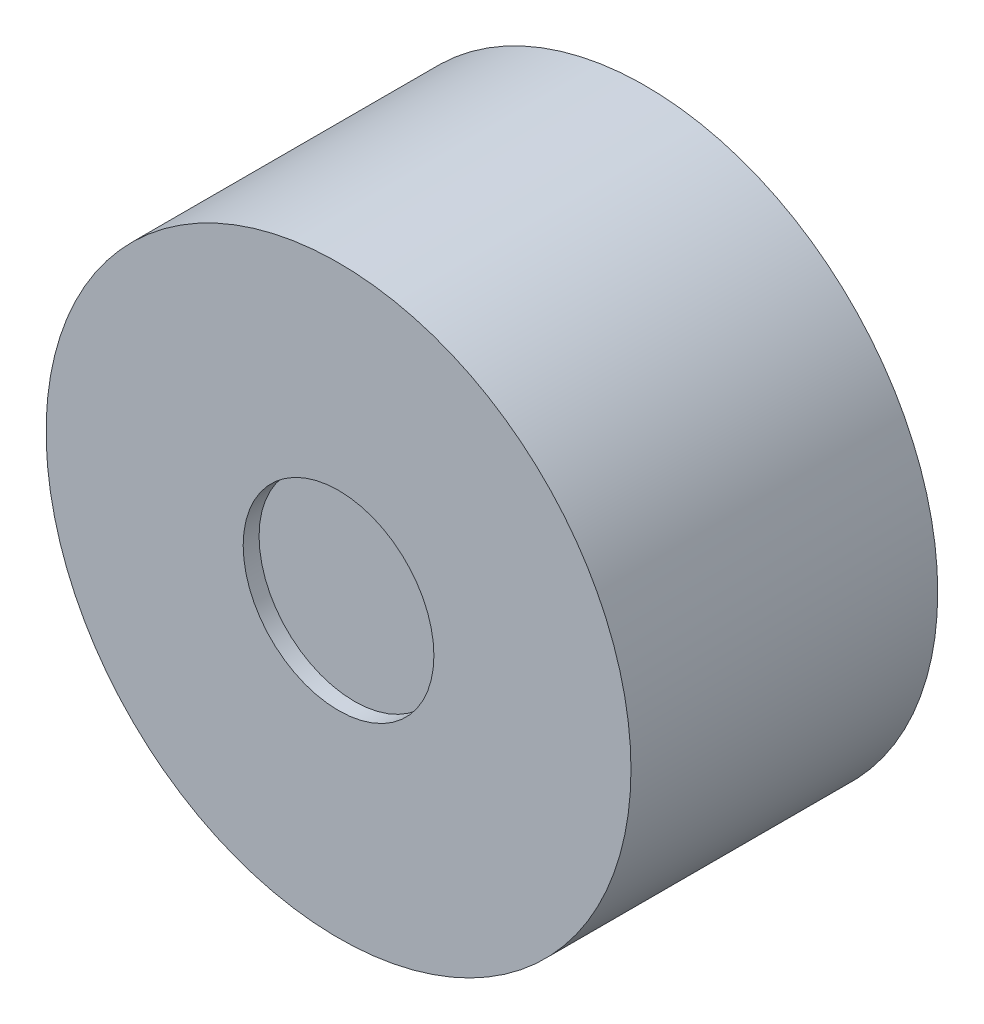
ISO-10303-21;
HEADER;
FILE_DESCRIPTION(('STEP AP214'),'2;1');
FILE_NAME('part.step','',(''),(''),'','','');
FILE_SCHEMA(('AUTOMOTIVE_DESIGN { 1 0 10303 214 1 1 1 1 }'));
ENDSEC;
DATA;
#1=APPLICATION_CONTEXT('core data for automotive mechanical design processes');
#2=APPLICATION_PROTOCOL_DEFINITION('international standard','automotive_design',2000,#1);
#3=PRODUCT_CONTEXT('',#1,'mechanical');
#4=PRODUCT('Part','Part','',(#3));
#5=PRODUCT_RELATED_PRODUCT_CATEGORY('part','',(#4));
#6=PRODUCT_DEFINITION_FORMATION('','',#4);
#7=PRODUCT_DEFINITION_CONTEXT('part definition',#1,'design');
#8=PRODUCT_DEFINITION('design','',#6,#7);
#9=PRODUCT_DEFINITION_SHAPE('','',#8);
#10=(LENGTH_UNIT() NAMED_UNIT(*) SI_UNIT(.MILLI.,.METRE.));
#11=(NAMED_UNIT(*) PLANE_ANGLE_UNIT() SI_UNIT($,.RADIAN.));
#12=(NAMED_UNIT(*) SI_UNIT($,.STERADIAN.) SOLID_ANGLE_UNIT());
#13=UNCERTAINTY_MEASURE_WITH_UNIT(LENGTH_MEASURE(1.E-05),#10,'distance_accuracy_value','');
#14=(GEOMETRIC_REPRESENTATION_CONTEXT(3) GLOBAL_UNCERTAINTY_ASSIGNED_CONTEXT((#13)) GLOBAL_UNIT_ASSIGNED_CONTEXT((#10,
#11,#12)) REPRESENTATION_CONTEXT('',''));
#15=CARTESIAN_POINT('',(0.,0.,0.));
#16=DIRECTION('',(0.,0.,1.));
#17=DIRECTION('',(1.,0.,0.));
#18=AXIS2_PLACEMENT_3D('',#15,#16,#17);
#19=CARTESIAN_POINT('',(0.,0.,24.3));
#20=DIRECTION('',(0.,0.,-1.));
#21=DIRECTION('',(-1.,0.,0.));
#22=AXIS2_PLACEMENT_3D('',#19,#20,#21);
#23=CYLINDRICAL_SURFACE('',#22,18.4);
#24=CARTESIAN_POINT('',(0.,0.,0.));
#25=DIRECTION('',(0.,0.,1.));
#26=DIRECTION('',(1.,0.,0.));
#27=AXIS2_PLACEMENT_3D('',#24,#25,#26);
#28=CIRCLE('',#27,18.4);
#29=CARTESIAN_POINT('',(18.4,0.,0.));
#30=VERTEX_POINT('',#29);
#31=EDGE_CURVE('E10',#30,#30,#28,.T.);
#32=ORIENTED_EDGE('',*,*,#31,.T.);
#33=EDGE_LOOP('',(#32));
#34=FACE_BOUND('',#33,.T.);
#35=CARTESIAN_POINT('',(0.,0.,19.3));
#36=DIRECTION('',(0.,0.,1.));
#37=DIRECTION('',(1.,0.,0.));
#38=AXIS2_PLACEMENT_3D('',#35,#36,#37);
#39=CIRCLE('',#38,18.4);
#40=CARTESIAN_POINT('',(18.4,0.,19.3));
#41=VERTEX_POINT('',#40);
#42=EDGE_CURVE('E49',#41,#41,#39,.T.);
#43=ORIENTED_EDGE('',*,*,#42,.F.);
#44=EDGE_LOOP('',(#43));
#45=FACE_BOUND('',#44,.T.);
#46=ADVANCED_FACE('F31',(#34,#45),#23,.T.);
#47=CARTESIAN_POINT('',(0.,0.,0.));
#48=DIRECTION('',(0.,0.,1.));
#49=DIRECTION('',(1.,0.,0.));
#50=AXIS2_PLACEMENT_3D('',#47,#48,#49);
#51=PLANE('',#50);
#52=CARTESIAN_POINT('',(9.5,0.,0.));
#53=DIRECTION('',(0.,0.,-1.));
#54=DIRECTION('',(-1.,0.,0.));
#55=AXIS2_PLACEMENT_3D('',#52,#53,#54);
#56=CIRCLE('',#55,1.25);
#57=CARTESIAN_POINT('',(8.25,0.,0.));
#58=VERTEX_POINT('',#57);
#59=EDGE_CURVE('E41',#58,#58,#56,.T.);
#60=ORIENTED_EDGE('',*,*,#59,.F.);
#61=EDGE_LOOP('',(#60));
#62=FACE_BOUND('',#61,.T.);
#63=CARTESIAN_POINT('',(0.,-9.5,0.));
#64=DIRECTION('',(0.,0.,-1.));
#65=DIRECTION('',(-1.,0.,0.));
#66=AXIS2_PLACEMENT_3D('',#63,#64,#65);
#67=CIRCLE('',#66,1.25);
#68=CARTESIAN_POINT('',(-1.25,-9.5,0.));
#69=VERTEX_POINT('',#68);
#70=EDGE_CURVE('E62',#69,#69,#67,.T.);
#71=ORIENTED_EDGE('',*,*,#70,.F.);
#72=EDGE_LOOP('',(#71));
#73=FACE_BOUND('',#72,.T.);
#74=CARTESIAN_POINT('',(-9.5,0.,0.));
#75=DIRECTION('',(0.,0.,-1.));
#76=DIRECTION('',(-1.,0.,0.));
#77=AXIS2_PLACEMENT_3D('',#74,#75,#76);
#78=CIRCLE('',#77,1.25);
#79=CARTESIAN_POINT('',(-10.75,0.,0.));
#80=VERTEX_POINT('',#79);
#81=EDGE_CURVE('E56',#80,#80,#78,.T.);
#82=ORIENTED_EDGE('',*,*,#81,.F.);
#83=EDGE_LOOP('',(#82));
#84=FACE_BOUND('',#83,.T.);
#85=CARTESIAN_POINT('',(0.,9.5,0.));
#86=DIRECTION('',(0.,0.,-1.));
#87=DIRECTION('',(-1.,0.,0.));
#88=AXIS2_PLACEMENT_3D('',#85,#86,#87);
#89=CIRCLE('',#88,1.25);
#90=CARTESIAN_POINT('',(-1.25,9.5,0.));
#91=VERTEX_POINT('',#90);
#92=EDGE_CURVE('E55',#91,#91,#89,.T.);
#93=ORIENTED_EDGE('',*,*,#92,.F.);
#94=EDGE_LOOP('',(#93));
#95=FACE_BOUND('',#94,.T.);
#96=CARTESIAN_POINT('',(0.,0.,0.));
#97=DIRECTION('',(0.,0.,-1.));
#98=DIRECTION('',(-1.,0.,0.));
#99=AXIS2_PLACEMENT_3D('',#96,#97,#98);
#100=CIRCLE('',#99,5.);
#101=CARTESIAN_POINT('',(-5.,0.,0.));
#102=VERTEX_POINT('',#101);
#103=EDGE_CURVE('E67',#102,#102,#100,.T.);
#104=ORIENTED_EDGE('',*,*,#103,.F.);
#105=EDGE_LOOP('',(#104));
#106=FACE_BOUND('',#105,.T.);
#107=ORIENTED_EDGE('',*,*,#31,.F.);
#108=EDGE_LOOP('',(#107));
#109=FACE_BOUND('',#108,.T.);
#110=ADVANCED_FACE('F77',(#62,#73,#84,#95,#106,#109),#51,.F.);
#111=CARTESIAN_POINT('',(0.,0.,5.));
#112=DIRECTION('',(0.,0.,-1.));
#113=DIRECTION('',(-1.,0.,0.));
#114=AXIS2_PLACEMENT_3D('',#111,#112,#113);
#115=CYLINDRICAL_SURFACE('',#114,5.);
#116=CARTESIAN_POINT('',(0.,0.,5.));
#117=DIRECTION('',(0.,0.,-1.));
#118=DIRECTION('',(-1.,0.,0.));
#119=AXIS2_PLACEMENT_3D('',#116,#117,#118);
#120=CIRCLE('',#119,5.);
#121=CARTESIAN_POINT('',(-5.,0.,5.));
#122=VERTEX_POINT('',#121);
#123=EDGE_CURVE('E46',#122,#122,#120,.T.);
#124=ORIENTED_EDGE('',*,*,#123,.F.);
#125=EDGE_LOOP('',(#124));
#126=FACE_BOUND('',#125,.T.);
#127=ORIENTED_EDGE('',*,*,#103,.T.);
#128=EDGE_LOOP('',(#127));
#129=FACE_BOUND('',#128,.T.);
#130=ADVANCED_FACE('F80',(#126,#129),#115,.F.);
#131=CARTESIAN_POINT('',(0.,0.,5.));
#132=DIRECTION('',(0.,0.,-1.));
#133=DIRECTION('',(-1.,0.,0.));
#134=AXIS2_PLACEMENT_3D('',#131,#132,#133);
#135=PLANE('',#134);
#136=ORIENTED_EDGE('',*,*,#123,.T.);
#137=EDGE_LOOP('',(#136));
#138=FACE_BOUND('',#137,.T.);
#139=ADVANCED_FACE('F86',(#138),#135,.T.);
#140=CARTESIAN_POINT('',(0.,9.5,5.));
#141=DIRECTION('',(0.,0.,-1.));
#142=DIRECTION('',(-1.,0.,0.));
#143=AXIS2_PLACEMENT_3D('',#140,#141,#142);
#144=CYLINDRICAL_SURFACE('',#143,1.25);
#145=CARTESIAN_POINT('',(0.,9.5,5.));
#146=DIRECTION('',(0.,0.,-1.));
#147=DIRECTION('',(-1.,0.,0.));
#148=AXIS2_PLACEMENT_3D('',#145,#146,#147);
#149=CIRCLE('',#148,1.25);
#150=CARTESIAN_POINT('',(-1.25,9.5,5.));
#151=VERTEX_POINT('',#150);
#152=EDGE_CURVE('E70',#151,#151,#149,.T.);
#153=ORIENTED_EDGE('',*,*,#152,.F.);
#154=EDGE_LOOP('',(#153));
#155=FACE_BOUND('',#154,.T.);
#156=ORIENTED_EDGE('',*,*,#92,.T.);
#157=EDGE_LOOP('',(#156));
#158=FACE_BOUND('',#157,.T.);
#159=ADVANCED_FACE('F75',(#155,#158),#144,.F.);
#160=CARTESIAN_POINT('',(0.,9.5,5.));
#161=DIRECTION('',(0.,0.,-1.));
#162=DIRECTION('',(-1.,0.,0.));
#163=AXIS2_PLACEMENT_3D('',#160,#161,#162);
#164=PLANE('',#163);
#165=ORIENTED_EDGE('',*,*,#152,.T.);
#166=EDGE_LOOP('',(#165));
#167=FACE_BOUND('',#166,.T.);
#168=ADVANCED_FACE('F129',(#167),#164,.T.);
#169=CARTESIAN_POINT('',(-9.5,0.,5.));
#170=DIRECTION('',(0.,0.,-1.));
#171=DIRECTION('',(-1.,0.,0.));
#172=AXIS2_PLACEMENT_3D('',#169,#170,#171);
#173=CYLINDRICAL_SURFACE('',#172,1.25);
#174=CARTESIAN_POINT('',(-9.5,0.,5.));
#175=DIRECTION('',(0.,0.,-1.));
#176=DIRECTION('',(-1.,0.,0.));
#177=AXIS2_PLACEMENT_3D('',#174,#175,#176);
#178=CIRCLE('',#177,1.25);
#179=CARTESIAN_POINT('',(-10.75,0.,5.));
#180=VERTEX_POINT('',#179);
#181=EDGE_CURVE('E52',#180,#180,#178,.T.);
#182=ORIENTED_EDGE('',*,*,#181,.F.);
#183=EDGE_LOOP('',(#182));
#184=FACE_BOUND('',#183,.T.);
#185=ORIENTED_EDGE('',*,*,#81,.T.);
#186=EDGE_LOOP('',(#185));
#187=FACE_BOUND('',#186,.T.);
#188=ADVANCED_FACE('F132',(#184,#187),#173,.F.);
#189=CARTESIAN_POINT('',(-9.5,0.,5.));
#190=DIRECTION('',(0.,0.,-1.));
#191=DIRECTION('',(-1.,0.,0.));
#192=AXIS2_PLACEMENT_3D('',#189,#190,#191);
#193=PLANE('',#192);
#194=ORIENTED_EDGE('',*,*,#181,.T.);
#195=EDGE_LOOP('',(#194));
#196=FACE_BOUND('',#195,.T.);
#197=ADVANCED_FACE('F137',(#196),#193,.T.);
#198=CARTESIAN_POINT('',(0.,-9.5,5.));
#199=DIRECTION('',(0.,0.,-1.));
#200=DIRECTION('',(-1.,0.,0.));
#201=AXIS2_PLACEMENT_3D('',#198,#199,#200);
#202=CYLINDRICAL_SURFACE('',#201,1.25);
#203=CARTESIAN_POINT('',(0.,-9.5,5.));
#204=DIRECTION('',(0.,0.,-1.));
#205=DIRECTION('',(-1.,0.,0.));
#206=AXIS2_PLACEMENT_3D('',#203,#204,#205);
#207=CIRCLE('',#206,1.25);
#208=CARTESIAN_POINT('',(-1.25,-9.5,5.));
#209=VERTEX_POINT('',#208);
#210=EDGE_CURVE('E59',#209,#209,#207,.T.);
#211=ORIENTED_EDGE('',*,*,#210,.F.);
#212=EDGE_LOOP('',(#211));
#213=FACE_BOUND('',#212,.T.);
#214=ORIENTED_EDGE('',*,*,#70,.T.);
#215=EDGE_LOOP('',(#214));
#216=FACE_BOUND('',#215,.T.);
#217=ADVANCED_FACE('F144',(#213,#216),#202,.F.);
#218=CARTESIAN_POINT('',(0.,-9.5,5.));
#219=DIRECTION('',(0.,0.,-1.));
#220=DIRECTION('',(-1.,0.,0.));
#221=AXIS2_PLACEMENT_3D('',#218,#219,#220);
#222=PLANE('',#221);
#223=ORIENTED_EDGE('',*,*,#210,.T.);
#224=EDGE_LOOP('',(#223));
#225=FACE_BOUND('',#224,.T.);
#226=ADVANCED_FACE('F151',(#225),#222,.T.);
#227=CARTESIAN_POINT('',(9.5,0.,5.));
#228=DIRECTION('',(0.,0.,-1.));
#229=DIRECTION('',(-1.,0.,0.));
#230=AXIS2_PLACEMENT_3D('',#227,#228,#229);
#231=CYLINDRICAL_SURFACE('',#230,1.25);
#232=CARTESIAN_POINT('',(9.5,0.,5.));
#233=DIRECTION('',(0.,0.,-1.));
#234=DIRECTION('',(-1.,0.,0.));
#235=AXIS2_PLACEMENT_3D('',#232,#233,#234);
#236=CIRCLE('',#235,1.25);
#237=CARTESIAN_POINT('',(8.25,0.,5.));
#238=VERTEX_POINT('',#237);
#239=EDGE_CURVE('E37',#238,#238,#236,.T.);
#240=ORIENTED_EDGE('',*,*,#239,.F.);
#241=EDGE_LOOP('',(#240));
#242=FACE_BOUND('',#241,.T.);
#243=ORIENTED_EDGE('',*,*,#59,.T.);
#244=EDGE_LOOP('',(#243));
#245=FACE_BOUND('',#244,.T.);
#246=ADVANCED_FACE('F125',(#242,#245),#231,.F.);
#247=CARTESIAN_POINT('',(9.5,0.,5.));
#248=DIRECTION('',(0.,0.,-1.));
#249=DIRECTION('',(-1.,0.,0.));
#250=AXIS2_PLACEMENT_3D('',#247,#248,#249);
#251=PLANE('',#250);
#252=ORIENTED_EDGE('',*,*,#239,.T.);
#253=EDGE_LOOP('',(#252));
#254=FACE_BOUND('',#253,.T.);
#255=ADVANCED_FACE('F116',(#254),#251,.T.);
#256=CARTESIAN_POINT('',(0.,9.5,19.3));
#257=DIRECTION('',(0.,0.,1.));
#258=DIRECTION('',(1.,0.,0.));
#259=AXIS2_PLACEMENT_3D('',#256,#257,#258);
#260=PLANE('',#259);
#261=CARTESIAN_POINT('',(0.,0.,19.3));
#262=DIRECTION('',(0.,0.,1.));
#263=DIRECTION('',(1.,0.,0.));
#264=AXIS2_PLACEMENT_3D('',#261,#262,#263);
#265=CIRCLE('',#264,6.);
#266=CARTESIAN_POINT('',(6.,0.,19.3));
#267=VERTEX_POINT('',#266);
#268=EDGE_CURVE('E105',#267,#267,#265,.T.);
#269=ORIENTED_EDGE('',*,*,#268,.F.);
#270=EDGE_LOOP('',(#269));
#271=FACE_BOUND('',#270,.T.);
#272=ORIENTED_EDGE('',*,*,#42,.T.);
#273=EDGE_LOOP('',(#272));
#274=FACE_BOUND('',#273,.T.);
#275=ADVANCED_FACE('F114',(#271,#274),#260,.T.);
#276=CARTESIAN_POINT('',(0.,0.,18.3));
#277=DIRECTION('',(0.,0.,1.));
#278=DIRECTION('',(1.,0.,0.));
#279=AXIS2_PLACEMENT_3D('',#276,#277,#278);
#280=CYLINDRICAL_SURFACE('',#279,6.);
#281=CARTESIAN_POINT('',(0.,0.,18.3));
#282=DIRECTION('',(0.,0.,1.));
#283=DIRECTION('',(1.,0.,0.));
#284=AXIS2_PLACEMENT_3D('',#281,#282,#283);
#285=CIRCLE('',#284,6.);
#286=CARTESIAN_POINT('',(6.,0.,18.3));
#287=VERTEX_POINT('',#286);
#288=EDGE_CURVE('E103',#287,#287,#285,.T.);
#289=ORIENTED_EDGE('',*,*,#288,.F.);
#290=EDGE_LOOP('',(#289));
#291=FACE_BOUND('',#290,.T.);
#292=ORIENTED_EDGE('',*,*,#268,.T.);
#293=EDGE_LOOP('',(#292));
#294=FACE_BOUND('',#293,.T.);
#295=ADVANCED_FACE('F112',(#291,#294),#280,.F.);
#296=CARTESIAN_POINT('',(0.,0.,18.3));
#297=DIRECTION('',(0.,0.,1.));
#298=DIRECTION('',(1.,0.,0.));
#299=AXIS2_PLACEMENT_3D('',#296,#297,#298);
#300=PLANE('',#299);
#301=ORIENTED_EDGE('',*,*,#288,.T.);
#302=EDGE_LOOP('',(#301));
#303=FACE_BOUND('',#302,.T.);
#304=ADVANCED_FACE('F122',(#303),#300,.T.);
#305=CLOSED_SHELL('',(#46,#110,#130,#139,#159,#168,#188,#197,#217,#226,#246,#255,#275,#295,#304));
#306=MANIFOLD_SOLID_BREP('B2',#305);
#307=ADVANCED_BREP_SHAPE_REPRESENTATION('',(#18,#306),#14);
#308=SHAPE_DEFINITION_REPRESENTATION(#9,#307);
ENDSEC;
END-ISO-10303-21;
